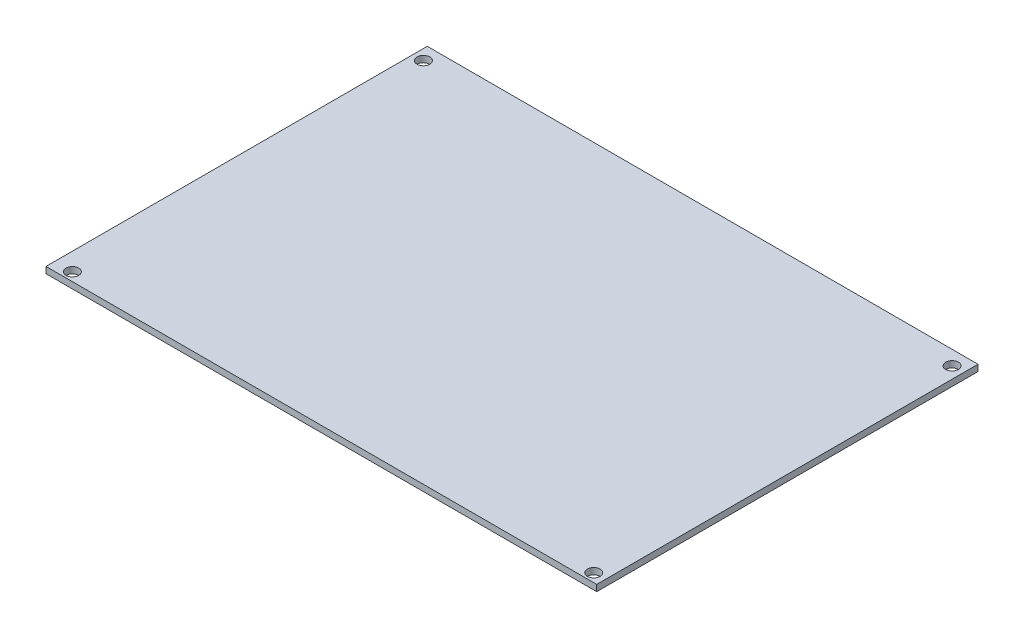
ISO-10303-21;
HEADER;
FILE_DESCRIPTION(('STEP AP214'),'2;1');
FILE_NAME('part.step','',(''),(''),'','','');
FILE_SCHEMA(('AUTOMOTIVE_DESIGN { 1 0 10303 214 1 1 1 1 }'));
ENDSEC;
DATA;
#1=APPLICATION_CONTEXT('core data for automotive mechanical design processes');
#2=APPLICATION_PROTOCOL_DEFINITION('international standard','automotive_design',2000,#1);
#3=PRODUCT_CONTEXT('',#1,'mechanical');
#4=PRODUCT('Part','Part','',(#3));
#5=PRODUCT_RELATED_PRODUCT_CATEGORY('part','',(#4));
#6=PRODUCT_DEFINITION_FORMATION('','',#4);
#7=PRODUCT_DEFINITION_CONTEXT('part definition',#1,'design');
#8=PRODUCT_DEFINITION('design','',#6,#7);
#9=PRODUCT_DEFINITION_SHAPE('','',#8);
#10=(LENGTH_UNIT() NAMED_UNIT(*) SI_UNIT(.MILLI.,.METRE.));
#11=(NAMED_UNIT(*) PLANE_ANGLE_UNIT() SI_UNIT($,.RADIAN.));
#12=(NAMED_UNIT(*) SI_UNIT($,.STERADIAN.) SOLID_ANGLE_UNIT());
#13=UNCERTAINTY_MEASURE_WITH_UNIT(LENGTH_MEASURE(1.E-05),#10,'distance_accuracy_value','');
#14=(GEOMETRIC_REPRESENTATION_CONTEXT(3) GLOBAL_UNCERTAINTY_ASSIGNED_CONTEXT((#13)) GLOBAL_UNIT_ASSIGNED_CONTEXT((#10,
#11,#12)) REPRESENTATION_CONTEXT('',''));
#15=CARTESIAN_POINT('',(0.,0.,0.));
#16=DIRECTION('',(0.,0.,1.));
#17=DIRECTION('',(1.,0.,0.));
#18=AXIS2_PLACEMENT_3D('',#15,#16,#17);
#19=CARTESIAN_POINT('',(65.,1.5,-45.));
#20=DIRECTION('',(-1.,0.,0.));
#21=DIRECTION('',(0.,0.,1.));
#22=AXIS2_PLACEMENT_3D('',#19,#20,#21);
#23=PLANE('',#22);
#24=DIRECTION('',(0.,0.,-1.));
#25=VECTOR('',#24,1.);
#26=CARTESIAN_POINT('',(65.,0.,-45.));
#27=LINE('',#26,#25);
#28=CARTESIAN_POINT('',(65.,0.,45.));
#29=VERTEX_POINT('',#28);
#30=CARTESIAN_POINT('',(65.,0.,-45.));
#31=VERTEX_POINT('',#30);
#32=EDGE_CURVE('E98',#29,#31,#27,.T.);
#33=ORIENTED_EDGE('',*,*,#32,.T.);
#34=DIRECTION('',(0.,-1.,0.));
#35=VECTOR('',#34,1.);
#36=CARTESIAN_POINT('',(65.,1.5,-45.));
#37=LINE('',#36,#35);
#38=CARTESIAN_POINT('',(65.,1.5,-45.));
#39=VERTEX_POINT('',#38);
#40=EDGE_CURVE('E11',#39,#31,#37,.T.);
#41=ORIENTED_EDGE('',*,*,#40,.F.);
#42=DIRECTION('',(0.,0.,-1.));
#43=VECTOR('',#42,1.);
#44=CARTESIAN_POINT('',(65.,1.5,-45.));
#45=LINE('',#44,#43);
#46=CARTESIAN_POINT('',(65.,1.5,45.));
#47=VERTEX_POINT('',#46);
#48=EDGE_CURVE('E86',#47,#39,#45,.T.);
#49=ORIENTED_EDGE('',*,*,#48,.F.);
#50=DIRECTION('',(0.,-1.,0.));
#51=VECTOR('',#50,1.);
#52=CARTESIAN_POINT('',(65.,1.5,45.));
#53=LINE('',#52,#51);
#54=EDGE_CURVE('E94',#47,#29,#53,.T.);
#55=ORIENTED_EDGE('',*,*,#54,.T.);
#56=EDGE_LOOP('',(#33,#41,#49,#55));
#57=FACE_BOUND('',#56,.T.);
#58=ADVANCED_FACE('F35',(#57),#23,.F.);
#59=CARTESIAN_POINT('',(-65.,1.5,-45.));
#60=DIRECTION('',(0.,0.,1.));
#61=DIRECTION('',(1.,0.,0.));
#62=AXIS2_PLACEMENT_3D('',#59,#60,#61);
#63=PLANE('',#62);
#64=DIRECTION('',(-1.,0.,0.));
#65=VECTOR('',#64,1.);
#66=CARTESIAN_POINT('',(-65.,0.,-45.));
#67=LINE('',#66,#65);
#68=CARTESIAN_POINT('',(-65.,0.,-45.));
#69=VERTEX_POINT('',#68);
#70=EDGE_CURVE('E90',#31,#69,#67,.T.);
#71=ORIENTED_EDGE('',*,*,#70,.T.);
#72=DIRECTION('',(0.,-1.,0.));
#73=VECTOR('',#72,1.);
#74=CARTESIAN_POINT('',(-65.,1.5,-45.));
#75=LINE('',#74,#73);
#76=CARTESIAN_POINT('',(-65.,1.5,-45.));
#77=VERTEX_POINT('',#76);
#78=EDGE_CURVE('E43',#77,#69,#75,.T.);
#79=ORIENTED_EDGE('',*,*,#78,.F.);
#80=DIRECTION('',(-1.,0.,0.));
#81=VECTOR('',#80,1.);
#82=CARTESIAN_POINT('',(-65.,1.5,-45.));
#83=LINE('',#82,#81);
#84=EDGE_CURVE('E81',#39,#77,#83,.T.);
#85=ORIENTED_EDGE('',*,*,#84,.F.);
#86=ORIENTED_EDGE('',*,*,#40,.T.);
#87=EDGE_LOOP('',(#71,#79,#85,#86));
#88=FACE_BOUND('',#87,.T.);
#89=ADVANCED_FACE('F89',(#88),#63,.F.);
#90=CARTESIAN_POINT('',(-65.,1.5,-45.));
#91=DIRECTION('',(1.,0.,0.));
#92=DIRECTION('',(0.,0.,-1.));
#93=AXIS2_PLACEMENT_3D('',#90,#91,#92);
#94=PLANE('',#93);
#95=DIRECTION('',(0.,0.,1.));
#96=VECTOR('',#95,1.);
#97=CARTESIAN_POINT('',(-65.,0.,-45.));
#98=LINE('',#97,#96);
#99=CARTESIAN_POINT('',(-65.,0.,45.));
#100=VERTEX_POINT('',#99);
#101=EDGE_CURVE('E68',#69,#100,#98,.T.);
#102=ORIENTED_EDGE('',*,*,#101,.T.);
#103=DIRECTION('',(0.,-1.,0.));
#104=VECTOR('',#103,1.);
#105=CARTESIAN_POINT('',(-65.,1.5,45.));
#106=LINE('',#105,#104);
#107=CARTESIAN_POINT('',(-65.,1.5,45.));
#108=VERTEX_POINT('',#107);
#109=EDGE_CURVE('E91',#108,#100,#106,.T.);
#110=ORIENTED_EDGE('',*,*,#109,.F.);
#111=DIRECTION('',(0.,0.,1.));
#112=VECTOR('',#111,1.);
#113=CARTESIAN_POINT('',(-65.,1.5,-45.));
#114=LINE('',#113,#112);
#115=EDGE_CURVE('E84',#77,#108,#114,.T.);
#116=ORIENTED_EDGE('',*,*,#115,.F.);
#117=ORIENTED_EDGE('',*,*,#78,.T.);
#118=EDGE_LOOP('',(#102,#110,#116,#117));
#119=FACE_BOUND('',#118,.T.);
#120=ADVANCED_FACE('F92',(#119),#94,.F.);
#121=CARTESIAN_POINT('',(-65.,1.5,45.));
#122=DIRECTION('',(0.,0.,-1.));
#123=DIRECTION('',(-1.,0.,0.));
#124=AXIS2_PLACEMENT_3D('',#121,#122,#123);
#125=PLANE('',#124);
#126=DIRECTION('',(1.,0.,0.));
#127=VECTOR('',#126,1.);
#128=CARTESIAN_POINT('',(-65.,0.,45.));
#129=LINE('',#128,#127);
#130=EDGE_CURVE('E74',#100,#29,#129,.T.);
#131=ORIENTED_EDGE('',*,*,#130,.T.);
#132=ORIENTED_EDGE('',*,*,#54,.F.);
#133=DIRECTION('',(1.,0.,0.));
#134=VECTOR('',#133,1.);
#135=CARTESIAN_POINT('',(-65.,1.5,45.));
#136=LINE('',#135,#134);
#137=EDGE_CURVE('E51',#108,#47,#136,.T.);
#138=ORIENTED_EDGE('',*,*,#137,.F.);
#139=ORIENTED_EDGE('',*,*,#109,.T.);
#140=EDGE_LOOP('',(#131,#132,#138,#139));
#141=FACE_BOUND('',#140,.T.);
#142=ADVANCED_FACE('F106',(#141),#125,.F.);
#143=CARTESIAN_POINT('',(0.,1.5,0.));
#144=DIRECTION('',(0.,1.,0.));
#145=DIRECTION('',(0.,0.,1.));
#146=AXIS2_PLACEMENT_3D('',#143,#144,#145);
#147=PLANE('',#146);
#148=CARTESIAN_POINT('',(-60.7965452238259,1.5,42.9723321907889));
#149=DIRECTION('',(0.,1.,0.));
#150=DIRECTION('',(0.,0.,1.));
#151=AXIS2_PLACEMENT_3D('',#148,#149,#150);
#152=CIRCLE('',#151,1.5);
#153=CARTESIAN_POINT('',(-60.7965452238259,1.5,44.4723321907889));
#154=VERTEX_POINT('',#153);
#155=EDGE_CURVE('E130',#154,#154,#152,.T.);
#156=ORIENTED_EDGE('',*,*,#155,.F.);
#157=EDGE_LOOP('',(#156));
#158=FACE_BOUND('',#157,.T.);
#159=CARTESIAN_POINT('',(62.2591269535839,1.5,42.9723321907889));
#160=DIRECTION('',(0.,1.,0.));
#161=DIRECTION('',(0.,0.,1.));
#162=AXIS2_PLACEMENT_3D('',#159,#160,#161);
#163=CIRCLE('',#162,1.5);
#164=CARTESIAN_POINT('',(62.2591269535839,1.5,44.4723321907888));
#165=VERTEX_POINT('',#164);
#166=EDGE_CURVE('E124',#165,#165,#163,.T.);
#167=ORIENTED_EDGE('',*,*,#166,.F.);
#168=EDGE_LOOP('',(#167));
#169=FACE_BOUND('',#168,.T.);
#170=CARTESIAN_POINT('',(62.2591269535839,1.5,-41.6188729091892));
#171=DIRECTION('',(0.,1.,0.));
#172=DIRECTION('',(0.,0.,1.));
#173=AXIS2_PLACEMENT_3D('',#170,#171,#172);
#174=CIRCLE('',#173,1.5);
#175=CARTESIAN_POINT('',(62.2591269535839,1.5,-40.1188729091892));
#176=VERTEX_POINT('',#175);
#177=EDGE_CURVE('E118',#176,#176,#174,.T.);
#178=ORIENTED_EDGE('',*,*,#177,.F.);
#179=EDGE_LOOP('',(#178));
#180=FACE_BOUND('',#179,.T.);
#181=CARTESIAN_POINT('',(-62.5298188099038,1.5,-41.6188729091892));
#182=DIRECTION('',(0.,1.,0.));
#183=DIRECTION('',(0.,0.,1.));
#184=AXIS2_PLACEMENT_3D('',#181,#182,#183);
#185=CIRCLE('',#184,1.5);
#186=CARTESIAN_POINT('',(-62.5298188099038,1.5,-40.1188729091892));
#187=VERTEX_POINT('',#186);
#188=EDGE_CURVE('E112',#187,#187,#185,.T.);
#189=ORIENTED_EDGE('',*,*,#188,.F.);
#190=EDGE_LOOP('',(#189));
#191=FACE_BOUND('',#190,.T.);
#192=ORIENTED_EDGE('',*,*,#48,.T.);
#193=ORIENTED_EDGE('',*,*,#84,.T.);
#194=ORIENTED_EDGE('',*,*,#115,.T.);
#195=ORIENTED_EDGE('',*,*,#137,.T.);
#196=EDGE_LOOP('',(#192,#193,#194,#195));
#197=FACE_BOUND('',#196,.T.);
#198=ADVANCED_FACE('F82',(#158,#169,#180,#191,#197),#147,.T.);
#199=CARTESIAN_POINT('',(0.,0.,0.));
#200=DIRECTION('',(0.,1.,0.));
#201=DIRECTION('',(0.,0.,1.));
#202=AXIS2_PLACEMENT_3D('',#199,#200,#201);
#203=PLANE('',#202);
#204=CARTESIAN_POINT('',(-60.7965452238259,0.,42.9723321907889));
#205=DIRECTION('',(0.,1.,0.));
#206=DIRECTION('',(0.,0.,1.));
#207=AXIS2_PLACEMENT_3D('',#204,#205,#206);
#208=CIRCLE('',#207,1.5);
#209=CARTESIAN_POINT('',(-60.7965452238259,0.,44.4723321907889));
#210=VERTEX_POINT('',#209);
#211=EDGE_CURVE('E127',#210,#210,#208,.T.);
#212=ORIENTED_EDGE('',*,*,#211,.T.);
#213=EDGE_LOOP('',(#212));
#214=FACE_BOUND('',#213,.T.);
#215=CARTESIAN_POINT('',(62.2591269535839,0.,42.9723321907889));
#216=DIRECTION('',(0.,1.,0.));
#217=DIRECTION('',(0.,0.,1.));
#218=AXIS2_PLACEMENT_3D('',#215,#216,#217);
#219=CIRCLE('',#218,1.5);
#220=CARTESIAN_POINT('',(62.2591269535839,0.,44.4723321907888));
#221=VERTEX_POINT('',#220);
#222=EDGE_CURVE('E121',#221,#221,#219,.T.);
#223=ORIENTED_EDGE('',*,*,#222,.T.);
#224=EDGE_LOOP('',(#223));
#225=FACE_BOUND('',#224,.T.);
#226=CARTESIAN_POINT('',(62.2591269535839,0.,-41.6188729091892));
#227=DIRECTION('',(0.,1.,0.));
#228=DIRECTION('',(0.,0.,1.));
#229=AXIS2_PLACEMENT_3D('',#226,#227,#228);
#230=CIRCLE('',#229,1.5);
#231=CARTESIAN_POINT('',(62.2591269535839,0.,-40.1188729091892));
#232=VERTEX_POINT('',#231);
#233=EDGE_CURVE('E115',#232,#232,#230,.T.);
#234=ORIENTED_EDGE('',*,*,#233,.T.);
#235=EDGE_LOOP('',(#234));
#236=FACE_BOUND('',#235,.T.);
#237=CARTESIAN_POINT('',(-62.5298188099038,0.,-41.6188729091892));
#238=DIRECTION('',(0.,1.,0.));
#239=DIRECTION('',(0.,0.,1.));
#240=AXIS2_PLACEMENT_3D('',#237,#238,#239);
#241=CIRCLE('',#240,1.5);
#242=CARTESIAN_POINT('',(-62.5298188099038,0.,-40.1188729091892));
#243=VERTEX_POINT('',#242);
#244=EDGE_CURVE('E101',#243,#243,#241,.T.);
#245=ORIENTED_EDGE('',*,*,#244,.T.);
#246=EDGE_LOOP('',(#245));
#247=FACE_BOUND('',#246,.T.);
#248=ORIENTED_EDGE('',*,*,#32,.F.);
#249=ORIENTED_EDGE('',*,*,#130,.F.);
#250=ORIENTED_EDGE('',*,*,#101,.F.);
#251=ORIENTED_EDGE('',*,*,#70,.F.);
#252=EDGE_LOOP('',(#248,#249,#250,#251));
#253=FACE_BOUND('',#252,.T.);
#254=ADVANCED_FACE('F109',(#214,#225,#236,#247,#253),#203,.F.);
#255=CARTESIAN_POINT('',(-62.5298188099038,0.,-41.6188729091892));
#256=DIRECTION('',(0.,1.,0.));
#257=DIRECTION('',(0.,0.,1.));
#258=AXIS2_PLACEMENT_3D('',#255,#256,#257);
#259=CYLINDRICAL_SURFACE('',#258,1.5);
#260=ORIENTED_EDGE('',*,*,#244,.F.);
#261=EDGE_LOOP('',(#260));
#262=FACE_BOUND('',#261,.T.);
#263=ORIENTED_EDGE('',*,*,#188,.T.);
#264=EDGE_LOOP('',(#263));
#265=FACE_BOUND('',#264,.T.);
#266=ADVANCED_FACE('F154',(#262,#265),#259,.F.);
#267=CARTESIAN_POINT('',(62.2591269535839,0.,-41.6188729091892));
#268=DIRECTION('',(0.,1.,0.));
#269=DIRECTION('',(0.,0.,1.));
#270=AXIS2_PLACEMENT_3D('',#267,#268,#269);
#271=CYLINDRICAL_SURFACE('',#270,1.5);
#272=ORIENTED_EDGE('',*,*,#233,.F.);
#273=EDGE_LOOP('',(#272));
#274=FACE_BOUND('',#273,.T.);
#275=ORIENTED_EDGE('',*,*,#177,.T.);
#276=EDGE_LOOP('',(#275));
#277=FACE_BOUND('',#276,.T.);
#278=ADVANCED_FACE('F156',(#274,#277),#271,.F.);
#279=CARTESIAN_POINT('',(62.2591269535839,0.,42.9723321907889));
#280=DIRECTION('',(0.,1.,0.));
#281=DIRECTION('',(0.,0.,1.));
#282=AXIS2_PLACEMENT_3D('',#279,#280,#281);
#283=CYLINDRICAL_SURFACE('',#282,1.5);
#284=ORIENTED_EDGE('',*,*,#222,.F.);
#285=EDGE_LOOP('',(#284));
#286=FACE_BOUND('',#285,.T.);
#287=ORIENTED_EDGE('',*,*,#166,.T.);
#288=EDGE_LOOP('',(#287));
#289=FACE_BOUND('',#288,.T.);
#290=ADVANCED_FACE('F141',(#286,#289),#283,.F.);
#291=CARTESIAN_POINT('',(-60.7965452238259,0.,42.9723321907889));
#292=DIRECTION('',(0.,1.,0.));
#293=DIRECTION('',(0.,0.,1.));
#294=AXIS2_PLACEMENT_3D('',#291,#292,#293);
#295=CYLINDRICAL_SURFACE('',#294,1.5);
#296=ORIENTED_EDGE('',*,*,#211,.F.);
#297=EDGE_LOOP('',(#296));
#298=FACE_BOUND('',#297,.T.);
#299=ORIENTED_EDGE('',*,*,#155,.T.);
#300=EDGE_LOOP('',(#299));
#301=FACE_BOUND('',#300,.T.);
#302=ADVANCED_FACE('F138',(#298,#301),#295,.F.);
#303=CLOSED_SHELL('',(#58,#89,#120,#142,#198,#254,#266,#278,#290,#302));
#304=MANIFOLD_SOLID_BREP('B2',#303);
#305=ADVANCED_BREP_SHAPE_REPRESENTATION('',(#18,#304),#14);
#306=SHAPE_DEFINITION_REPRESENTATION(#9,#305);
ENDSEC;
END-ISO-10303-21;
